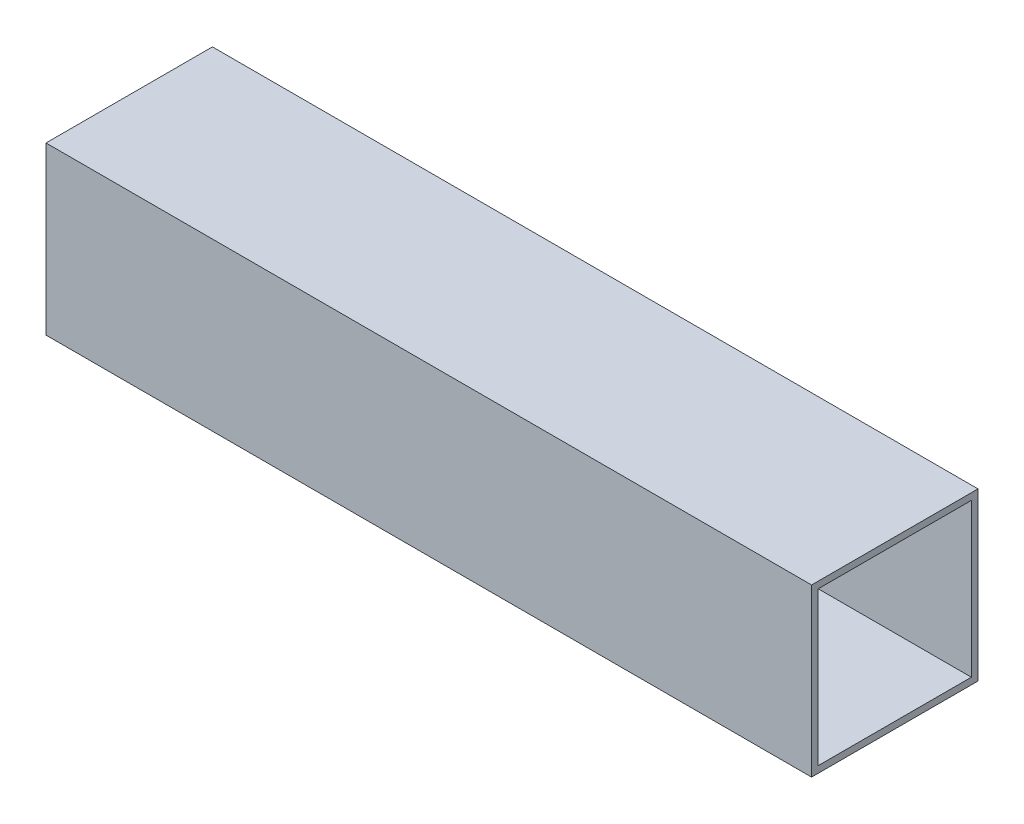
ISO-10303-21;
HEADER;
FILE_DESCRIPTION(('STEP AP214'),'2;1');
FILE_NAME('part.step','',(''),(''),'','','');
FILE_SCHEMA(('AUTOMOTIVE_DESIGN { 1 0 10303 214 1 1 1 1 }'));
ENDSEC;
DATA;
#1=APPLICATION_CONTEXT('core data for automotive mechanical design processes');
#2=APPLICATION_PROTOCOL_DEFINITION('international standard','automotive_design',2000,#1);
#3=PRODUCT_CONTEXT('',#1,'mechanical');
#4=PRODUCT('Part','Part','',(#3));
#5=PRODUCT_RELATED_PRODUCT_CATEGORY('part','',(#4));
#6=PRODUCT_DEFINITION_FORMATION('','',#4);
#7=PRODUCT_DEFINITION_CONTEXT('part definition',#1,'design');
#8=PRODUCT_DEFINITION('design','',#6,#7);
#9=PRODUCT_DEFINITION_SHAPE('','',#8);
#10=(LENGTH_UNIT() NAMED_UNIT(*) SI_UNIT(.MILLI.,.METRE.));
#11=(NAMED_UNIT(*) PLANE_ANGLE_UNIT() SI_UNIT($,.RADIAN.));
#12=(NAMED_UNIT(*) SI_UNIT($,.STERADIAN.) SOLID_ANGLE_UNIT());
#13=UNCERTAINTY_MEASURE_WITH_UNIT(LENGTH_MEASURE(1.E-05),#10,'distance_accuracy_value','');
#14=(GEOMETRIC_REPRESENTATION_CONTEXT(3) GLOBAL_UNCERTAINTY_ASSIGNED_CONTEXT((#13)) GLOBAL_UNIT_ASSIGNED_CONTEXT((#10,
#11,#12)) REPRESENTATION_CONTEXT('',''));
#15=CARTESIAN_POINT('',(0.,0.,0.));
#16=DIRECTION('',(0.,0.,1.));
#17=DIRECTION('',(1.,0.,0.));
#18=AXIS2_PLACEMENT_3D('',#15,#16,#17);
#19=CARTESIAN_POINT('',(115.,0.,0.));
#20=DIRECTION('',(1.,0.,0.));
#21=DIRECTION('',(0.,0.,-1.));
#22=AXIS2_PLACEMENT_3D('',#19,#20,#21);
#23=PLANE('',#22);
#24=DIRECTION('',(0.,-1.,0.));
#25=VECTOR('',#24,1.);
#26=CARTESIAN_POINT('',(115.,-12.5,12.5));
#27=LINE('',#26,#25);
#28=CARTESIAN_POINT('',(115.,12.5,12.5));
#29=VERTEX_POINT('',#28);
#30=CARTESIAN_POINT('',(115.,-12.5,12.5));
#31=VERTEX_POINT('',#30);
#32=EDGE_CURVE('E140',#29,#31,#27,.T.);
#33=ORIENTED_EDGE('',*,*,#32,.T.);
#34=DIRECTION('',(0.,0.,-1.));
#35=VECTOR('',#34,1.);
#36=CARTESIAN_POINT('',(115.,-12.5,-12.5));
#37=LINE('',#36,#35);
#38=CARTESIAN_POINT('',(115.,-12.5,-12.5));
#39=VERTEX_POINT('',#38);
#40=EDGE_CURVE('E143',#31,#39,#37,.T.);
#41=ORIENTED_EDGE('',*,*,#40,.T.);
#42=DIRECTION('',(0.,1.,0.));
#43=VECTOR('',#42,1.);
#44=CARTESIAN_POINT('',(115.,-12.5,-12.5));
#45=LINE('',#44,#43);
#46=CARTESIAN_POINT('',(115.,12.5,-12.5));
#47=VERTEX_POINT('',#46);
#48=EDGE_CURVE('E146',#39,#47,#45,.T.);
#49=ORIENTED_EDGE('',*,*,#48,.T.);
#50=DIRECTION('',(0.,0.,1.));
#51=VECTOR('',#50,1.);
#52=CARTESIAN_POINT('',(115.,12.5,-12.5));
#53=LINE('',#52,#51);
#54=EDGE_CURVE('E148',#47,#29,#53,.T.);
#55=ORIENTED_EDGE('',*,*,#54,.T.);
#56=EDGE_LOOP('',(#33,#41,#49,#55));
#57=FACE_BOUND('',#56,.T.);
#58=DIRECTION('',(0.,0.,-1.));
#59=VECTOR('',#58,1.);
#60=CARTESIAN_POINT('',(115.,-11.5,-11.5));
#61=LINE('',#60,#59);
#62=CARTESIAN_POINT('',(115.,-11.5,11.5));
#63=VERTEX_POINT('',#62);
#64=CARTESIAN_POINT('',(115.,-11.5,-11.5));
#65=VERTEX_POINT('',#64);
#66=EDGE_CURVE('E112',#63,#65,#61,.T.);
#67=ORIENTED_EDGE('',*,*,#66,.F.);
#68=DIRECTION('',(0.,-1.,0.));
#69=VECTOR('',#68,1.);
#70=CARTESIAN_POINT('',(115.,-11.5,11.5));
#71=LINE('',#70,#69);
#72=CARTESIAN_POINT('',(115.,11.5,11.5));
#73=VERTEX_POINT('',#72);
#74=EDGE_CURVE('E104',#73,#63,#71,.T.);
#75=ORIENTED_EDGE('',*,*,#74,.F.);
#76=DIRECTION('',(0.,0.,1.));
#77=VECTOR('',#76,1.);
#78=CARTESIAN_POINT('',(115.,11.5,-11.5));
#79=LINE('',#78,#77);
#80=CARTESIAN_POINT('',(115.,11.5,-11.5));
#81=VERTEX_POINT('',#80);
#82=EDGE_CURVE('E126',#81,#73,#79,.T.);
#83=ORIENTED_EDGE('',*,*,#82,.F.);
#84=DIRECTION('',(0.,1.,0.));
#85=VECTOR('',#84,1.);
#86=CARTESIAN_POINT('',(115.,-11.5,-11.5));
#87=LINE('',#86,#85);
#88=EDGE_CURVE('E124',#65,#81,#87,.T.);
#89=ORIENTED_EDGE('',*,*,#88,.F.);
#90=EDGE_LOOP('',(#67,#75,#83,#89));
#91=FACE_BOUND('',#90,.T.);
#92=ADVANCED_FACE('F39',(#57,#91),#23,.T.);
#93=CARTESIAN_POINT('',(0.,0.,0.));
#94=DIRECTION('',(1.,0.,0.));
#95=DIRECTION('',(0.,0.,-1.));
#96=AXIS2_PLACEMENT_3D('',#93,#94,#95);
#97=PLANE('',#96);
#98=DIRECTION('',(0.,-1.,0.));
#99=VECTOR('',#98,1.);
#100=CARTESIAN_POINT('',(0.,-12.5,12.5));
#101=LINE('',#100,#99);
#102=CARTESIAN_POINT('',(0.,12.5,12.5));
#103=VERTEX_POINT('',#102);
#104=CARTESIAN_POINT('',(0.,-12.5,12.5));
#105=VERTEX_POINT('',#104);
#106=EDGE_CURVE('E120',#103,#105,#101,.T.);
#107=ORIENTED_EDGE('',*,*,#106,.F.);
#108=DIRECTION('',(0.,0.,1.));
#109=VECTOR('',#108,1.);
#110=CARTESIAN_POINT('',(0.,12.5,-12.5));
#111=LINE('',#110,#109);
#112=CARTESIAN_POINT('',(0.,12.5,-12.5));
#113=VERTEX_POINT('',#112);
#114=EDGE_CURVE('E144',#113,#103,#111,.T.);
#115=ORIENTED_EDGE('',*,*,#114,.F.);
#116=DIRECTION('',(0.,1.,0.));
#117=VECTOR('',#116,1.);
#118=CARTESIAN_POINT('',(0.,-12.5,-12.5));
#119=LINE('',#118,#117);
#120=CARTESIAN_POINT('',(0.,-12.5,-12.5));
#121=VERTEX_POINT('',#120);
#122=EDGE_CURVE('E155',#121,#113,#119,.T.);
#123=ORIENTED_EDGE('',*,*,#122,.F.);
#124=DIRECTION('',(0.,0.,-1.));
#125=VECTOR('',#124,1.);
#126=CARTESIAN_POINT('',(0.,-12.5,-12.5));
#127=LINE('',#126,#125);
#128=EDGE_CURVE('E153',#105,#121,#127,.T.);
#129=ORIENTED_EDGE('',*,*,#128,.F.);
#130=EDGE_LOOP('',(#107,#115,#123,#129));
#131=FACE_BOUND('',#130,.T.);
#132=DIRECTION('',(0.,-1.,0.));
#133=VECTOR('',#132,1.);
#134=CARTESIAN_POINT('',(0.,-11.5,11.5));
#135=LINE('',#134,#133);
#136=CARTESIAN_POINT('',(0.,11.5,11.5));
#137=VERTEX_POINT('',#136);
#138=CARTESIAN_POINT('',(0.,-11.5,11.5));
#139=VERTEX_POINT('',#138);
#140=EDGE_CURVE('E62',#137,#139,#135,.T.);
#141=ORIENTED_EDGE('',*,*,#140,.T.);
#142=DIRECTION('',(0.,0.,-1.));
#143=VECTOR('',#142,1.);
#144=CARTESIAN_POINT('',(0.,-11.5,-11.5));
#145=LINE('',#144,#143);
#146=CARTESIAN_POINT('',(0.,-11.5,-11.5));
#147=VERTEX_POINT('',#146);
#148=EDGE_CURVE('E119',#139,#147,#145,.T.);
#149=ORIENTED_EDGE('',*,*,#148,.T.);
#150=DIRECTION('',(0.,1.,0.));
#151=VECTOR('',#150,1.);
#152=CARTESIAN_POINT('',(0.,-11.5,-11.5));
#153=LINE('',#152,#151);
#154=CARTESIAN_POINT('',(0.,11.5,-11.5));
#155=VERTEX_POINT('',#154);
#156=EDGE_CURVE('E132',#147,#155,#153,.T.);
#157=ORIENTED_EDGE('',*,*,#156,.T.);
#158=DIRECTION('',(0.,0.,1.));
#159=VECTOR('',#158,1.);
#160=CARTESIAN_POINT('',(0.,11.5,-11.5));
#161=LINE('',#160,#159);
#162=EDGE_CURVE('E113',#155,#137,#161,.T.);
#163=ORIENTED_EDGE('',*,*,#162,.T.);
#164=EDGE_LOOP('',(#141,#149,#157,#163));
#165=FACE_BOUND('',#164,.T.);
#166=ADVANCED_FACE('F173',(#131,#165),#97,.F.);
#167=CARTESIAN_POINT('',(115.,-12.5,12.5));
#168=DIRECTION('',(0.,0.,-1.));
#169=DIRECTION('',(-1.,0.,0.));
#170=AXIS2_PLACEMENT_3D('',#167,#168,#169);
#171=PLANE('',#170);
#172=ORIENTED_EDGE('',*,*,#106,.T.);
#173=DIRECTION('',(-1.,0.,0.));
#174=VECTOR('',#173,1.);
#175=CARTESIAN_POINT('',(115.,-12.5,12.5));
#176=LINE('',#175,#174);
#177=EDGE_CURVE('E11',#31,#105,#176,.T.);
#178=ORIENTED_EDGE('',*,*,#177,.F.);
#179=ORIENTED_EDGE('',*,*,#32,.F.);
#180=DIRECTION('',(-1.,0.,0.));
#181=VECTOR('',#180,1.);
#182=CARTESIAN_POINT('',(115.,12.5,12.5));
#183=LINE('',#182,#181);
#184=EDGE_CURVE('E150',#29,#103,#183,.T.);
#185=ORIENTED_EDGE('',*,*,#184,.T.);
#186=EDGE_LOOP('',(#172,#178,#179,#185));
#187=FACE_BOUND('',#186,.T.);
#188=ADVANCED_FACE('F41',(#187),#171,.F.);
#189=CARTESIAN_POINT('',(115.,-12.5,-12.5));
#190=DIRECTION('',(0.,1.,0.));
#191=DIRECTION('',(0.,0.,1.));
#192=AXIS2_PLACEMENT_3D('',#189,#190,#191);
#193=PLANE('',#192);
#194=ORIENTED_EDGE('',*,*,#128,.T.);
#195=DIRECTION('',(-1.,0.,0.));
#196=VECTOR('',#195,1.);
#197=CARTESIAN_POINT('',(115.,-12.5,-12.5));
#198=LINE('',#197,#196);
#199=EDGE_CURVE('E47',#39,#121,#198,.T.);
#200=ORIENTED_EDGE('',*,*,#199,.F.);
#201=ORIENTED_EDGE('',*,*,#40,.F.);
#202=ORIENTED_EDGE('',*,*,#177,.T.);
#203=EDGE_LOOP('',(#194,#200,#201,#202));
#204=FACE_BOUND('',#203,.T.);
#205=ADVANCED_FACE('F183',(#204),#193,.F.);
#206=CARTESIAN_POINT('',(115.,-12.5,-12.5));
#207=DIRECTION('',(0.,0.,1.));
#208=DIRECTION('',(1.,0.,0.));
#209=AXIS2_PLACEMENT_3D('',#206,#207,#208);
#210=PLANE('',#209);
#211=ORIENTED_EDGE('',*,*,#122,.T.);
#212=DIRECTION('',(-1.,0.,0.));
#213=VECTOR('',#212,1.);
#214=CARTESIAN_POINT('',(115.,12.5,-12.5));
#215=LINE('',#214,#213);
#216=EDGE_CURVE('E160',#47,#113,#215,.T.);
#217=ORIENTED_EDGE('',*,*,#216,.F.);
#218=ORIENTED_EDGE('',*,*,#48,.F.);
#219=ORIENTED_EDGE('',*,*,#199,.T.);
#220=EDGE_LOOP('',(#211,#217,#218,#219));
#221=FACE_BOUND('',#220,.T.);
#222=ADVANCED_FACE('F167',(#221),#210,.F.);
#223=CARTESIAN_POINT('',(115.,12.5,-12.5));
#224=DIRECTION('',(0.,-1.,0.));
#225=DIRECTION('',(0.,0.,-1.));
#226=AXIS2_PLACEMENT_3D('',#223,#224,#225);
#227=PLANE('',#226);
#228=ORIENTED_EDGE('',*,*,#114,.T.);
#229=ORIENTED_EDGE('',*,*,#184,.F.);
#230=ORIENTED_EDGE('',*,*,#54,.F.);
#231=ORIENTED_EDGE('',*,*,#216,.T.);
#232=EDGE_LOOP('',(#228,#229,#230,#231));
#233=FACE_BOUND('',#232,.T.);
#234=ADVANCED_FACE('F177',(#233),#227,.F.);
#235=CARTESIAN_POINT('',(115.,-11.5,11.5));
#236=DIRECTION('',(0.,0.,-1.));
#237=DIRECTION('',(-1.,0.,0.));
#238=AXIS2_PLACEMENT_3D('',#235,#236,#237);
#239=PLANE('',#238);
#240=ORIENTED_EDGE('',*,*,#140,.F.);
#241=DIRECTION('',(-1.,0.,0.));
#242=VECTOR('',#241,1.);
#243=CARTESIAN_POINT('',(115.,11.5,11.5));
#244=LINE('',#243,#242);
#245=EDGE_CURVE('E108',#73,#137,#244,.T.);
#246=ORIENTED_EDGE('',*,*,#245,.F.);
#247=ORIENTED_EDGE('',*,*,#74,.T.);
#248=DIRECTION('',(-1.,0.,0.));
#249=VECTOR('',#248,1.);
#250=CARTESIAN_POINT('',(115.,-11.5,11.5));
#251=LINE('',#250,#249);
#252=EDGE_CURVE('E107',#63,#139,#251,.T.);
#253=ORIENTED_EDGE('',*,*,#252,.T.);
#254=EDGE_LOOP('',(#240,#246,#247,#253));
#255=FACE_BOUND('',#254,.T.);
#256=ADVANCED_FACE('F106',(#255),#239,.T.);
#257=CARTESIAN_POINT('',(115.,-11.5,-11.5));
#258=DIRECTION('',(0.,1.,0.));
#259=DIRECTION('',(0.,0.,1.));
#260=AXIS2_PLACEMENT_3D('',#257,#258,#259);
#261=PLANE('',#260);
#262=ORIENTED_EDGE('',*,*,#148,.F.);
#263=ORIENTED_EDGE('',*,*,#252,.F.);
#264=ORIENTED_EDGE('',*,*,#66,.T.);
#265=DIRECTION('',(-1.,0.,0.));
#266=VECTOR('',#265,1.);
#267=CARTESIAN_POINT('',(115.,-11.5,-11.5));
#268=LINE('',#267,#266);
#269=EDGE_CURVE('E121',#65,#147,#268,.T.);
#270=ORIENTED_EDGE('',*,*,#269,.T.);
#271=EDGE_LOOP('',(#262,#263,#264,#270));
#272=FACE_BOUND('',#271,.T.);
#273=ADVANCED_FACE('F116',(#272),#261,.T.);
#274=CARTESIAN_POINT('',(115.,-11.5,-11.5));
#275=DIRECTION('',(0.,0.,1.));
#276=DIRECTION('',(1.,0.,0.));
#277=AXIS2_PLACEMENT_3D('',#274,#275,#276);
#278=PLANE('',#277);
#279=ORIENTED_EDGE('',*,*,#156,.F.);
#280=ORIENTED_EDGE('',*,*,#269,.F.);
#281=ORIENTED_EDGE('',*,*,#88,.T.);
#282=DIRECTION('',(-1.,0.,0.));
#283=VECTOR('',#282,1.);
#284=CARTESIAN_POINT('',(115.,11.5,-11.5));
#285=LINE('',#284,#283);
#286=EDGE_CURVE('E54',#81,#155,#285,.T.);
#287=ORIENTED_EDGE('',*,*,#286,.T.);
#288=EDGE_LOOP('',(#279,#280,#281,#287));
#289=FACE_BOUND('',#288,.T.);
#290=ADVANCED_FACE('F206',(#289),#278,.T.);
#291=CARTESIAN_POINT('',(115.,11.5,-11.5));
#292=DIRECTION('',(0.,-1.,0.));
#293=DIRECTION('',(0.,0.,-1.));
#294=AXIS2_PLACEMENT_3D('',#291,#292,#293);
#295=PLANE('',#294);
#296=ORIENTED_EDGE('',*,*,#162,.F.);
#297=ORIENTED_EDGE('',*,*,#286,.F.);
#298=ORIENTED_EDGE('',*,*,#82,.T.);
#299=ORIENTED_EDGE('',*,*,#245,.T.);
#300=EDGE_LOOP('',(#296,#297,#298,#299));
#301=FACE_BOUND('',#300,.T.);
#302=ADVANCED_FACE('F210',(#301),#295,.T.);
#303=CLOSED_SHELL('',(#92,#166,#188,#205,#222,#234,#256,#273,#290,#302));
#304=MANIFOLD_SOLID_BREP('B2',#303);
#305=ADVANCED_BREP_SHAPE_REPRESENTATION('',(#18,#304),#14);
#306=SHAPE_DEFINITION_REPRESENTATION(#9,#305);
ENDSEC;
END-ISO-10303-21;
